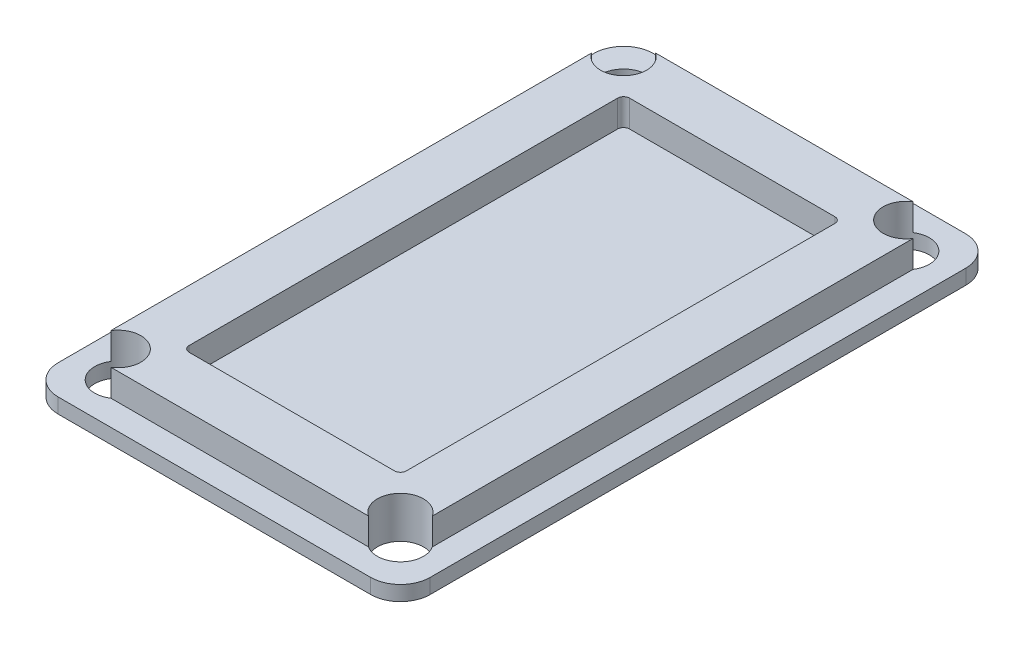
ISO-10303-21;
HEADER;
FILE_DESCRIPTION(('STEP AP214'),'2;1');
FILE_NAME('part.step','',(''),(''),'','','');
FILE_SCHEMA(('AUTOMOTIVE_DESIGN { 1 0 10303 214 1 1 1 1 }'));
ENDSEC;
DATA;
#1=APPLICATION_CONTEXT('core data for automotive mechanical design processes');
#2=APPLICATION_PROTOCOL_DEFINITION('international standard','automotive_design',2000,#1);
#3=PRODUCT_CONTEXT('',#1,'mechanical');
#4=PRODUCT('Part','Part','',(#3));
#5=PRODUCT_RELATED_PRODUCT_CATEGORY('part','',(#4));
#6=PRODUCT_DEFINITION_FORMATION('','',#4);
#7=PRODUCT_DEFINITION_CONTEXT('part definition',#1,'design');
#8=PRODUCT_DEFINITION('design','',#6,#7);
#9=PRODUCT_DEFINITION_SHAPE('','',#8);
#10=(LENGTH_UNIT() NAMED_UNIT(*) SI_UNIT(.MILLI.,.METRE.));
#11=(NAMED_UNIT(*) PLANE_ANGLE_UNIT() SI_UNIT($,.RADIAN.));
#12=(NAMED_UNIT(*) SI_UNIT($,.STERADIAN.) SOLID_ANGLE_UNIT());
#13=UNCERTAINTY_MEASURE_WITH_UNIT(LENGTH_MEASURE(1.E-05),#10,'distance_accuracy_value','');
#14=(GEOMETRIC_REPRESENTATION_CONTEXT(3) GLOBAL_UNCERTAINTY_ASSIGNED_CONTEXT((#13)) GLOBAL_UNIT_ASSIGNED_CONTEXT((#10,
#11,#12)) REPRESENTATION_CONTEXT('',''));
#15=CARTESIAN_POINT('',(0.,0.,0.));
#16=DIRECTION('',(0.,0.,1.));
#17=DIRECTION('',(1.,0.,0.));
#18=AXIS2_PLACEMENT_3D('',#15,#16,#17);
#19=CARTESIAN_POINT('',(10.5,2.8,-18.));
#20=DIRECTION('',(0.,1.,0.));
#21=DIRECTION('',(0.,0.,1.));
#22=AXIS2_PLACEMENT_3D('',#19,#20,#21);
#23=PLANE('',#22);
#24=CARTESIAN_POINT('',(-9.50000000000001,2.8,-17.));
#25=DIRECTION('',(0.,1.,0.));
#26=DIRECTION('',(0.,0.,1.));
#27=AXIS2_PLACEMENT_3D('',#24,#25,#26);
#28=CIRCLE('',#27,1.55);
#29=CARTESIAN_POINT('',(-8.65590284919331,2.8,-18.3));
#30=VERTEX_POINT('',#29);
#31=CARTESIAN_POINT('',(-10.8,2.8,-16.1559028491933));
#32=VERTEX_POINT('',#31);
#33=EDGE_CURVE('E626',#30,#32,#28,.F.);
#34=ORIENTED_EDGE('',*,*,#33,.T.);
#35=DIRECTION('',(0.,0.,1.));
#36=VECTOR('',#35,1.);
#37=CARTESIAN_POINT('',(-10.8,2.8,-18.));
#38=LINE('',#37,#36);
#39=CARTESIAN_POINT('',(-10.8,2.8,16.1559028491933));
#40=VERTEX_POINT('',#39);
#41=EDGE_CURVE('E237',#32,#40,#38,.T.);
#42=ORIENTED_EDGE('',*,*,#41,.T.);
#43=CARTESIAN_POINT('',(-9.50000000000001,2.8,17.));
#44=DIRECTION('',(0.,1.,0.));
#45=DIRECTION('',(0.,0.,1.));
#46=AXIS2_PLACEMENT_3D('',#43,#44,#45);
#47=CIRCLE('',#46,1.55);
#48=CARTESIAN_POINT('',(-8.6559028491933,2.8,18.3));
#49=VERTEX_POINT('',#48);
#50=EDGE_CURVE('E736',#40,#49,#47,.F.);
#51=ORIENTED_EDGE('',*,*,#50,.T.);
#52=DIRECTION('',(1.,0.,0.));
#53=VECTOR('',#52,1.);
#54=CARTESIAN_POINT('',(-10.5,2.8,18.3));
#55=LINE('',#54,#53);
#56=CARTESIAN_POINT('',(8.6559028491933,2.8,18.3));
#57=VERTEX_POINT('',#56);
#58=EDGE_CURVE('E646',#49,#57,#55,.T.);
#59=ORIENTED_EDGE('',*,*,#58,.T.);
#60=CARTESIAN_POINT('',(9.50000000000001,2.8,17.));
#61=DIRECTION('',(0.,1.,0.));
#62=DIRECTION('',(0.,0.,1.));
#63=AXIS2_PLACEMENT_3D('',#60,#61,#62);
#64=CIRCLE('',#63,1.55);
#65=CARTESIAN_POINT('',(10.8,2.8,16.1559028491933));
#66=VERTEX_POINT('',#65);
#67=EDGE_CURVE('E213',#57,#66,#64,.F.);
#68=ORIENTED_EDGE('',*,*,#67,.T.);
#69=DIRECTION('',(0.,0.,-1.));
#70=VECTOR('',#69,1.);
#71=CARTESIAN_POINT('',(10.8,2.8,18.));
#72=LINE('',#71,#70);
#73=CARTESIAN_POINT('',(10.8,2.8,-16.1559028491933));
#74=VERTEX_POINT('',#73);
#75=EDGE_CURVE('E221',#66,#74,#72,.T.);
#76=ORIENTED_EDGE('',*,*,#75,.T.);
#77=CARTESIAN_POINT('',(9.50000000000001,2.8,-17.));
#78=DIRECTION('',(0.,1.,0.));
#79=DIRECTION('',(0.,0.,1.));
#80=AXIS2_PLACEMENT_3D('',#77,#78,#79);
#81=CIRCLE('',#80,1.55);
#82=CARTESIAN_POINT('',(8.65590284919331,2.8,-18.3));
#83=VERTEX_POINT('',#82);
#84=EDGE_CURVE('E55',#74,#83,#81,.F.);
#85=ORIENTED_EDGE('',*,*,#84,.T.);
#86=DIRECTION('',(-1.,0.,0.));
#87=VECTOR('',#86,1.);
#88=CARTESIAN_POINT('',(10.5,2.8,-18.3));
#89=LINE('',#88,#87);
#90=EDGE_CURVE('E231',#83,#30,#89,.T.);
#91=ORIENTED_EDGE('',*,*,#90,.T.);
#92=EDGE_LOOP('',(#34,#42,#51,#59,#68,#76,#85,#91));
#93=FACE_BOUND('',#92,.T.);
#94=DIRECTION('',(1.,0.,0.));
#95=VECTOR('',#94,1.);
#96=CARTESIAN_POINT('',(-6.9,2.8,14.8));
#97=LINE('',#96,#95);
#98=CARTESIAN_POINT('',(-6.9,2.8,14.8));
#99=VERTEX_POINT('',#98);
#100=CARTESIAN_POINT('',(6.9,2.8,14.8));
#101=VERTEX_POINT('',#100);
#102=EDGE_CURVE('E725',#99,#101,#97,.T.);
#103=ORIENTED_EDGE('',*,*,#102,.F.);
#104=CARTESIAN_POINT('',(-6.9,2.8,14.4));
#105=DIRECTION('',(0.,1.,0.));
#106=DIRECTION('',(0.,0.,1.));
#107=AXIS2_PLACEMENT_3D('',#104,#105,#106);
#108=CIRCLE('',#107,0.4);
#109=CARTESIAN_POINT('',(-7.30000000000001,2.8,14.4));
#110=VERTEX_POINT('',#109);
#111=EDGE_CURVE('E677',#110,#99,#108,.T.);
#112=ORIENTED_EDGE('',*,*,#111,.F.);
#113=DIRECTION('',(0.,0.,1.));
#114=VECTOR('',#113,1.);
#115=CARTESIAN_POINT('',(-7.30000000000001,2.8,-14.4));
#116=LINE('',#115,#114);
#117=CARTESIAN_POINT('',(-7.30000000000001,2.8,-14.4));
#118=VERTEX_POINT('',#117);
#119=EDGE_CURVE('E672',#118,#110,#116,.T.);
#120=ORIENTED_EDGE('',*,*,#119,.F.);
#121=CARTESIAN_POINT('',(-6.9,2.8,-14.4));
#122=DIRECTION('',(0.,1.,0.));
#123=DIRECTION('',(0.,0.,1.));
#124=AXIS2_PLACEMENT_3D('',#121,#122,#123);
#125=CIRCLE('',#124,0.400000000000001);
#126=CARTESIAN_POINT('',(-6.9,2.8,-14.8));
#127=VERTEX_POINT('',#126);
#128=EDGE_CURVE('E709',#127,#118,#125,.T.);
#129=ORIENTED_EDGE('',*,*,#128,.F.);
#130=DIRECTION('',(-1.,0.,0.));
#131=VECTOR('',#130,1.);
#132=CARTESIAN_POINT('',(-6.9,2.8,-14.8));
#133=LINE('',#132,#131);
#134=CARTESIAN_POINT('',(6.9,2.8,-14.8));
#135=VERTEX_POINT('',#134);
#136=EDGE_CURVE('E713',#135,#127,#133,.T.);
#137=ORIENTED_EDGE('',*,*,#136,.F.);
#138=CARTESIAN_POINT('',(6.9,2.8,-14.4));
#139=DIRECTION('',(0.,1.,0.));
#140=DIRECTION('',(0.,0.,-1.));
#141=AXIS2_PLACEMENT_3D('',#138,#139,#140);
#142=CIRCLE('',#141,0.400000000000001);
#143=CARTESIAN_POINT('',(7.3,2.8,-14.4));
#144=VERTEX_POINT('',#143);
#145=EDGE_CURVE('E716',#144,#135,#142,.T.);
#146=ORIENTED_EDGE('',*,*,#145,.F.);
#147=DIRECTION('',(0.,0.,-1.));
#148=VECTOR('',#147,1.);
#149=CARTESIAN_POINT('',(7.3,2.8,-14.4));
#150=LINE('',#149,#148);
#151=CARTESIAN_POINT('',(7.3,2.8,14.4));
#152=VERTEX_POINT('',#151);
#153=EDGE_CURVE('E719',#152,#144,#150,.T.);
#154=ORIENTED_EDGE('',*,*,#153,.F.);
#155=CARTESIAN_POINT('',(6.9,2.8,14.4));
#156=DIRECTION('',(0.,1.,0.));
#157=DIRECTION('',(0.,0.,1.));
#158=AXIS2_PLACEMENT_3D('',#155,#156,#157);
#159=CIRCLE('',#158,0.399999999999999);
#160=EDGE_CURVE('E722',#101,#152,#159,.T.);
#161=ORIENTED_EDGE('',*,*,#160,.F.);
#162=EDGE_LOOP('',(#103,#112,#120,#129,#137,#146,#154,#161));
#163=FACE_BOUND('',#162,.T.);
#164=ADVANCED_FACE('F39',(#93,#163),#23,.T.);
#165=CARTESIAN_POINT('',(10.5,2.8,-18.3));
#166=DIRECTION('',(0.,0.,1.));
#167=DIRECTION('',(1.,0.,0.));
#168=AXIS2_PLACEMENT_3D('',#165,#166,#167);
#169=PLANE('',#168);
#170=DIRECTION('',(-1.,0.,0.));
#171=VECTOR('',#170,1.);
#172=CARTESIAN_POINT('',(10.5,1.,-18.3));
#173=LINE('',#172,#171);
#174=CARTESIAN_POINT('',(8.65590284919331,1.,-18.3));
#175=VERTEX_POINT('',#174);
#176=CARTESIAN_POINT('',(-8.65590284919331,1.,-18.3));
#177=VERTEX_POINT('',#176);
#178=EDGE_CURVE('E632',#175,#177,#173,.T.);
#179=ORIENTED_EDGE('',*,*,#178,.T.);
#180=DIRECTION('',(0.,-1.,0.));
#181=VECTOR('',#180,1.);
#182=CARTESIAN_POINT('',(-8.65590284919331,2.801,-18.3));
#183=LINE('',#182,#181);
#184=EDGE_CURVE('E622',#30,#177,#183,.T.);
#185=ORIENTED_EDGE('',*,*,#184,.F.);
#186=ORIENTED_EDGE('',*,*,#90,.F.);
#187=DIRECTION('',(0.,-1.,0.));
#188=VECTOR('',#187,1.);
#189=CARTESIAN_POINT('',(8.65590284919331,2.801,-18.3));
#190=LINE('',#189,#188);
#191=EDGE_CURVE('E633',#175,#83,#190,.F.);
#192=ORIENTED_EDGE('',*,*,#191,.F.);
#193=EDGE_LOOP('',(#179,#185,#186,#192));
#194=FACE_BOUND('',#193,.T.);
#195=ADVANCED_FACE('F367',(#194),#169,.F.);
#196=CARTESIAN_POINT('',(-10.8,2.8,-18.));
#197=DIRECTION('',(1.,0.,0.));
#198=DIRECTION('',(0.,0.,-1.));
#199=AXIS2_PLACEMENT_3D('',#196,#197,#198);
#200=PLANE('',#199);
#201=ORIENTED_EDGE('',*,*,#41,.F.);
#202=DIRECTION('',(0.,-1.,0.));
#203=VECTOR('',#202,1.);
#204=CARTESIAN_POINT('',(-10.8,2.801,-16.1559028491933));
#205=LINE('',#204,#203);
#206=CARTESIAN_POINT('',(-10.8,1.,-16.1559028491933));
#207=VERTEX_POINT('',#206);
#208=EDGE_CURVE('E746',#207,#32,#205,.F.);
#209=ORIENTED_EDGE('',*,*,#208,.F.);
#210=DIRECTION('',(0.,0.,1.));
#211=VECTOR('',#210,1.);
#212=CARTESIAN_POINT('',(-10.8,1.,-18.));
#213=LINE('',#212,#211);
#214=CARTESIAN_POINT('',(-10.8,1.,16.1559028491933));
#215=VERTEX_POINT('',#214);
#216=EDGE_CURVE('E239',#207,#215,#213,.T.);
#217=ORIENTED_EDGE('',*,*,#216,.T.);
#218=DIRECTION('',(0.,-1.,0.));
#219=VECTOR('',#218,1.);
#220=CARTESIAN_POINT('',(-10.8,2.801,16.1559028491933));
#221=LINE('',#220,#219);
#222=EDGE_CURVE('E706',#40,#215,#221,.T.);
#223=ORIENTED_EDGE('',*,*,#222,.F.);
#224=EDGE_LOOP('',(#201,#209,#217,#223));
#225=FACE_BOUND('',#224,.T.);
#226=ADVANCED_FACE('F373',(#225),#200,.F.);
#227=CARTESIAN_POINT('',(-10.5,2.8,18.3));
#228=DIRECTION('',(0.,0.,-1.));
#229=DIRECTION('',(-1.,0.,0.));
#230=AXIS2_PLACEMENT_3D('',#227,#228,#229);
#231=PLANE('',#230);
#232=DIRECTION('',(1.,0.,0.));
#233=VECTOR('',#232,1.);
#234=CARTESIAN_POINT('',(-10.5,1.,18.3));
#235=LINE('',#234,#233);
#236=CARTESIAN_POINT('',(-8.6559028491933,1.,18.3));
#237=VERTEX_POINT('',#236);
#238=CARTESIAN_POINT('',(8.6559028491933,1.,18.3));
#239=VERTEX_POINT('',#238);
#240=EDGE_CURVE('E232',#237,#239,#235,.T.);
#241=ORIENTED_EDGE('',*,*,#240,.T.);
#242=DIRECTION('',(0.,-1.,0.));
#243=VECTOR('',#242,1.);
#244=CARTESIAN_POINT('',(8.6559028491933,2.801,18.3));
#245=LINE('',#244,#243);
#246=EDGE_CURVE('E207',#57,#239,#245,.T.);
#247=ORIENTED_EDGE('',*,*,#246,.F.);
#248=ORIENTED_EDGE('',*,*,#58,.F.);
#249=DIRECTION('',(0.,-1.,0.));
#250=VECTOR('',#249,1.);
#251=CARTESIAN_POINT('',(-8.6559028491933,2.801,18.3));
#252=LINE('',#251,#250);
#253=EDGE_CURVE('E733',#237,#49,#252,.F.);
#254=ORIENTED_EDGE('',*,*,#253,.F.);
#255=EDGE_LOOP('',(#241,#247,#248,#254));
#256=FACE_BOUND('',#255,.T.);
#257=ADVANCED_FACE('F384',(#256),#231,.F.);
#258=CARTESIAN_POINT('',(10.8,2.8,18.));
#259=DIRECTION('',(-1.,0.,0.));
#260=DIRECTION('',(0.,0.,1.));
#261=AXIS2_PLACEMENT_3D('',#258,#259,#260);
#262=PLANE('',#261);
#263=DIRECTION('',(0.,0.,-1.));
#264=VECTOR('',#263,1.);
#265=CARTESIAN_POINT('',(10.8,1.,18.));
#266=LINE('',#265,#264);
#267=CARTESIAN_POINT('',(10.8,1.,16.1559028491933));
#268=VERTEX_POINT('',#267);
#269=CARTESIAN_POINT('',(10.8,1.,-16.1559028491933));
#270=VERTEX_POINT('',#269);
#271=EDGE_CURVE('E219',#268,#270,#266,.T.);
#272=ORIENTED_EDGE('',*,*,#271,.T.);
#273=DIRECTION('',(0.,-1.,0.));
#274=VECTOR('',#273,1.);
#275=CARTESIAN_POINT('',(10.8,2.801,-16.1559028491933));
#276=LINE('',#275,#274);
#277=EDGE_CURVE('E761',#74,#270,#276,.T.);
#278=ORIENTED_EDGE('',*,*,#277,.F.);
#279=ORIENTED_EDGE('',*,*,#75,.F.);
#280=DIRECTION('',(0.,-1.,0.));
#281=VECTOR('',#280,1.);
#282=CARTESIAN_POINT('',(10.8,2.801,16.1559028491933));
#283=LINE('',#282,#281);
#284=EDGE_CURVE('E204',#268,#66,#283,.F.);
#285=ORIENTED_EDGE('',*,*,#284,.F.);
#286=EDGE_LOOP('',(#272,#278,#279,#285));
#287=FACE_BOUND('',#286,.T.);
#288=ADVANCED_FACE('F218',(#287),#262,.F.);
#289=CARTESIAN_POINT('',(10.5,1.,-18.));
#290=DIRECTION('',(0.,-1.,0.));
#291=DIRECTION('',(0.,0.,-1.));
#292=AXIS2_PLACEMENT_3D('',#289,#290,#291);
#293=PLANE('',#292);
#294=CARTESIAN_POINT('',(10.5,1.,-18.));
#295=DIRECTION('',(0.,1.,0.));
#296=DIRECTION('',(0.,0.,-1.));
#297=AXIS2_PLACEMENT_3D('',#294,#295,#296);
#298=CIRCLE('',#297,2.);
#299=CARTESIAN_POINT('',(12.5,1.,-18.));
#300=VERTEX_POINT('',#299);
#301=CARTESIAN_POINT('',(10.5,1.,-20.));
#302=VERTEX_POINT('',#301);
#303=EDGE_CURVE('E243',#300,#302,#298,.T.);
#304=ORIENTED_EDGE('',*,*,#303,.T.);
#305=DIRECTION('',(-1.,0.,0.));
#306=VECTOR('',#305,1.);
#307=CARTESIAN_POINT('',(-10.5,1.,-20.));
#308=LINE('',#307,#306);
#309=CARTESIAN_POINT('',(-10.5,1.,-20.));
#310=VERTEX_POINT('',#309);
#311=EDGE_CURVE('E247',#302,#310,#308,.T.);
#312=ORIENTED_EDGE('',*,*,#311,.T.);
#313=CARTESIAN_POINT('',(-10.5,1.,-18.));
#314=DIRECTION('',(0.,1.,0.));
#315=DIRECTION('',(0.,0.,1.));
#316=AXIS2_PLACEMENT_3D('',#313,#314,#315);
#317=CIRCLE('',#316,2.);
#318=CARTESIAN_POINT('',(-12.5,1.,-18.));
#319=VERTEX_POINT('',#318);
#320=EDGE_CURVE('E251',#310,#319,#317,.T.);
#321=ORIENTED_EDGE('',*,*,#320,.T.);
#322=DIRECTION('',(0.,0.,1.));
#323=VECTOR('',#322,1.);
#324=CARTESIAN_POINT('',(-12.5,1.,-18.));
#325=LINE('',#324,#323);
#326=CARTESIAN_POINT('',(-12.5,1.,18.));
#327=VERTEX_POINT('',#326);
#328=EDGE_CURVE('E254',#319,#327,#325,.T.);
#329=ORIENTED_EDGE('',*,*,#328,.T.);
#330=CARTESIAN_POINT('',(-10.5,1.,18.));
#331=DIRECTION('',(0.,1.,0.));
#332=DIRECTION('',(0.,0.,1.));
#333=AXIS2_PLACEMENT_3D('',#330,#331,#332);
#334=CIRCLE('',#333,2.);
#335=CARTESIAN_POINT('',(-10.5,1.,20.));
#336=VERTEX_POINT('',#335);
#337=EDGE_CURVE('E257',#327,#336,#334,.T.);
#338=ORIENTED_EDGE('',*,*,#337,.T.);
#339=DIRECTION('',(1.,0.,0.));
#340=VECTOR('',#339,1.);
#341=CARTESIAN_POINT('',(-10.5,1.,20.));
#342=LINE('',#341,#340);
#343=CARTESIAN_POINT('',(10.5,1.,20.));
#344=VERTEX_POINT('',#343);
#345=EDGE_CURVE('E260',#336,#344,#342,.T.);
#346=ORIENTED_EDGE('',*,*,#345,.T.);
#347=CARTESIAN_POINT('',(10.5,1.,18.));
#348=DIRECTION('',(0.,1.,0.));
#349=DIRECTION('',(0.,0.,1.));
#350=AXIS2_PLACEMENT_3D('',#347,#348,#349);
#351=CIRCLE('',#350,2.);
#352=CARTESIAN_POINT('',(12.5,1.,18.));
#353=VERTEX_POINT('',#352);
#354=EDGE_CURVE('E263',#344,#353,#351,.T.);
#355=ORIENTED_EDGE('',*,*,#354,.T.);
#356=DIRECTION('',(0.,0.,-1.));
#357=VECTOR('',#356,1.);
#358=CARTESIAN_POINT('',(12.5,1.,-18.));
#359=LINE('',#358,#357);
#360=EDGE_CURVE('E266',#353,#300,#359,.T.);
#361=ORIENTED_EDGE('',*,*,#360,.T.);
#362=EDGE_LOOP('',(#304,#312,#321,#329,#338,#346,#355,#361));
#363=FACE_BOUND('',#362,.T.);
#364=ORIENTED_EDGE('',*,*,#216,.F.);
#365=CARTESIAN_POINT('',(-9.50000000000001,1.,-17.));
#366=DIRECTION('',(0.,-1.,0.));
#367=DIRECTION('',(0.,0.,-1.));
#368=AXIS2_PLACEMENT_3D('',#365,#366,#367);
#369=CIRCLE('',#368,1.55);
#370=EDGE_CURVE('E624',#177,#207,#369,.F.);
#371=ORIENTED_EDGE('',*,*,#370,.F.);
#372=ORIENTED_EDGE('',*,*,#178,.F.);
#373=CARTESIAN_POINT('',(9.50000000000001,1.,-17.));
#374=DIRECTION('',(0.,-1.,0.));
#375=DIRECTION('',(0.,0.,-1.));
#376=AXIS2_PLACEMENT_3D('',#373,#374,#375);
#377=CIRCLE('',#376,1.55);
#378=EDGE_CURVE('E229',#270,#175,#377,.F.);
#379=ORIENTED_EDGE('',*,*,#378,.F.);
#380=ORIENTED_EDGE('',*,*,#271,.F.);
#381=CARTESIAN_POINT('',(9.50000000000001,1.,17.));
#382=DIRECTION('',(0.,-1.,0.));
#383=DIRECTION('',(0.,0.,-1.));
#384=AXIS2_PLACEMENT_3D('',#381,#382,#383);
#385=CIRCLE('',#384,1.55);
#386=EDGE_CURVE('E201',#239,#268,#385,.F.);
#387=ORIENTED_EDGE('',*,*,#386,.F.);
#388=ORIENTED_EDGE('',*,*,#240,.F.);
#389=CARTESIAN_POINT('',(-9.50000000000001,1.,17.));
#390=DIRECTION('',(0.,-1.,0.));
#391=DIRECTION('',(0.,0.,-1.));
#392=AXIS2_PLACEMENT_3D('',#389,#390,#391);
#393=CIRCLE('',#392,1.55);
#394=EDGE_CURVE('E732',#215,#237,#393,.F.);
#395=ORIENTED_EDGE('',*,*,#394,.F.);
#396=EDGE_LOOP('',(#364,#371,#372,#379,#380,#387,#388,#395));
#397=FACE_BOUND('',#396,.T.);
#398=ADVANCED_FACE('F227',(#363,#397),#293,.F.);
#399=CARTESIAN_POINT('',(10.5,1.,-18.));
#400=DIRECTION('',(0.,-1.,0.));
#401=DIRECTION('',(0.,0.,-1.));
#402=AXIS2_PLACEMENT_3D('',#399,#400,#401);
#403=CYLINDRICAL_SURFACE('',#402,2.);
#404=CARTESIAN_POINT('',(10.5,0.,-18.));
#405=DIRECTION('',(0.,1.,0.));
#406=DIRECTION('',(0.,0.,-1.));
#407=AXIS2_PLACEMENT_3D('',#404,#405,#406);
#408=CIRCLE('',#407,2.);
#409=CARTESIAN_POINT('',(12.5,0.,-18.));
#410=VERTEX_POINT('',#409);
#411=CARTESIAN_POINT('',(10.5,0.,-20.));
#412=VERTEX_POINT('',#411);
#413=EDGE_CURVE('E270',#410,#412,#408,.T.);
#414=ORIENTED_EDGE('',*,*,#413,.T.);
#415=DIRECTION('',(0.,-1.,0.));
#416=VECTOR('',#415,1.);
#417=CARTESIAN_POINT('',(10.5,1.,-20.));
#418=LINE('',#417,#416);
#419=EDGE_CURVE('E11',#302,#412,#418,.T.);
#420=ORIENTED_EDGE('',*,*,#419,.F.);
#421=ORIENTED_EDGE('',*,*,#303,.F.);
#422=DIRECTION('',(0.,-1.,0.));
#423=VECTOR('',#422,1.);
#424=CARTESIAN_POINT('',(12.5,1.,-18.));
#425=LINE('',#424,#423);
#426=EDGE_CURVE('E269',#300,#410,#425,.T.);
#427=ORIENTED_EDGE('',*,*,#426,.T.);
#428=EDGE_LOOP('',(#414,#420,#421,#427));
#429=FACE_BOUND('',#428,.T.);
#430=ADVANCED_FACE('F41',(#429),#403,.T.);
#431=CARTESIAN_POINT('',(-10.5,1.,-20.));
#432=DIRECTION('',(0.,0.,1.));
#433=DIRECTION('',(1.,0.,0.));
#434=AXIS2_PLACEMENT_3D('',#431,#432,#433);
#435=PLANE('',#434);
#436=DIRECTION('',(-1.,0.,0.));
#437=VECTOR('',#436,1.);
#438=CARTESIAN_POINT('',(-10.5,0.,-20.));
#439=LINE('',#438,#437);
#440=CARTESIAN_POINT('',(-10.5,0.,-20.));
#441=VERTEX_POINT('',#440);
#442=EDGE_CURVE('E274',#412,#441,#439,.T.);
#443=ORIENTED_EDGE('',*,*,#442,.T.);
#444=DIRECTION('',(0.,-1.,0.));
#445=VECTOR('',#444,1.);
#446=CARTESIAN_POINT('',(-10.5,1.,-20.));
#447=LINE('',#446,#445);
#448=EDGE_CURVE('E48',#310,#441,#447,.T.);
#449=ORIENTED_EDGE('',*,*,#448,.F.);
#450=ORIENTED_EDGE('',*,*,#311,.F.);
#451=ORIENTED_EDGE('',*,*,#419,.T.);
#452=EDGE_LOOP('',(#443,#449,#450,#451));
#453=FACE_BOUND('',#452,.T.);
#454=ADVANCED_FACE('F344',(#453),#435,.F.);
#455=CARTESIAN_POINT('',(-10.5,1.,-18.));
#456=DIRECTION('',(0.,-1.,0.));
#457=DIRECTION('',(0.,0.,-1.));
#458=AXIS2_PLACEMENT_3D('',#455,#456,#457);
#459=CYLINDRICAL_SURFACE('',#458,2.);
#460=CARTESIAN_POINT('',(-10.5,0.,-18.));
#461=DIRECTION('',(0.,1.,0.));
#462=DIRECTION('',(0.,0.,1.));
#463=AXIS2_PLACEMENT_3D('',#460,#461,#462);
#464=CIRCLE('',#463,2.);
#465=CARTESIAN_POINT('',(-12.5,0.,-18.));
#466=VERTEX_POINT('',#465);
#467=EDGE_CURVE('E277',#441,#466,#464,.T.);
#468=ORIENTED_EDGE('',*,*,#467,.T.);
#469=DIRECTION('',(0.,-1.,0.));
#470=VECTOR('',#469,1.);
#471=CARTESIAN_POINT('',(-12.5,1.,-18.));
#472=LINE('',#471,#470);
#473=EDGE_CURVE('E313',#319,#466,#472,.T.);
#474=ORIENTED_EDGE('',*,*,#473,.F.);
#475=ORIENTED_EDGE('',*,*,#320,.F.);
#476=ORIENTED_EDGE('',*,*,#448,.T.);
#477=EDGE_LOOP('',(#468,#474,#475,#476));
#478=FACE_BOUND('',#477,.T.);
#479=ADVANCED_FACE('F322',(#478),#459,.T.);
#480=CARTESIAN_POINT('',(-12.5,1.,-18.));
#481=DIRECTION('',(1.,0.,0.));
#482=DIRECTION('',(0.,0.,-1.));
#483=AXIS2_PLACEMENT_3D('',#480,#481,#482);
#484=PLANE('',#483);
#485=DIRECTION('',(0.,0.,1.));
#486=VECTOR('',#485,1.);
#487=CARTESIAN_POINT('',(-12.5,0.,-18.));
#488=LINE('',#487,#486);
#489=CARTESIAN_POINT('',(-12.5,0.,18.));
#490=VERTEX_POINT('',#489);
#491=EDGE_CURVE('E280',#466,#490,#488,.T.);
#492=ORIENTED_EDGE('',*,*,#491,.T.);
#493=DIRECTION('',(0.,-1.,0.));
#494=VECTOR('',#493,1.);
#495=CARTESIAN_POINT('',(-12.5,1.,18.));
#496=LINE('',#495,#494);
#497=EDGE_CURVE('E309',#327,#490,#496,.T.);
#498=ORIENTED_EDGE('',*,*,#497,.F.);
#499=ORIENTED_EDGE('',*,*,#328,.F.);
#500=ORIENTED_EDGE('',*,*,#473,.T.);
#501=EDGE_LOOP('',(#492,#498,#499,#500));
#502=FACE_BOUND('',#501,.T.);
#503=ADVANCED_FACE('F333',(#502),#484,.F.);
#504=CARTESIAN_POINT('',(-10.5,1.,18.));
#505=DIRECTION('',(0.,-1.,0.));
#506=DIRECTION('',(0.,0.,-1.));
#507=AXIS2_PLACEMENT_3D('',#504,#505,#506);
#508=CYLINDRICAL_SURFACE('',#507,2.);
#509=CARTESIAN_POINT('',(-10.5,0.,18.));
#510=DIRECTION('',(0.,1.,0.));
#511=DIRECTION('',(0.,0.,1.));
#512=AXIS2_PLACEMENT_3D('',#509,#510,#511);
#513=CIRCLE('',#512,2.);
#514=CARTESIAN_POINT('',(-10.5,0.,20.));
#515=VERTEX_POINT('',#514);
#516=EDGE_CURVE('E283',#490,#515,#513,.T.);
#517=ORIENTED_EDGE('',*,*,#516,.T.);
#518=DIRECTION('',(0.,-1.,0.));
#519=VECTOR('',#518,1.);
#520=CARTESIAN_POINT('',(-10.5,1.,20.));
#521=LINE('',#520,#519);
#522=EDGE_CURVE('E305',#336,#515,#521,.T.);
#523=ORIENTED_EDGE('',*,*,#522,.F.);
#524=ORIENTED_EDGE('',*,*,#337,.F.);
#525=ORIENTED_EDGE('',*,*,#497,.T.);
#526=EDGE_LOOP('',(#517,#523,#524,#525));
#527=FACE_BOUND('',#526,.T.);
#528=ADVANCED_FACE('F337',(#527),#508,.T.);
#529=CARTESIAN_POINT('',(-10.5,1.,20.));
#530=DIRECTION('',(0.,0.,-1.));
#531=DIRECTION('',(-1.,0.,0.));
#532=AXIS2_PLACEMENT_3D('',#529,#530,#531);
#533=PLANE('',#532);
#534=DIRECTION('',(1.,0.,0.));
#535=VECTOR('',#534,1.);
#536=CARTESIAN_POINT('',(-10.5,0.,20.));
#537=LINE('',#536,#535);
#538=CARTESIAN_POINT('',(10.5,0.,20.));
#539=VERTEX_POINT('',#538);
#540=EDGE_CURVE('E286',#515,#539,#537,.T.);
#541=ORIENTED_EDGE('',*,*,#540,.T.);
#542=DIRECTION('',(0.,-1.,0.));
#543=VECTOR('',#542,1.);
#544=CARTESIAN_POINT('',(10.5,1.,20.));
#545=LINE('',#544,#543);
#546=EDGE_CURVE('E301',#344,#539,#545,.T.);
#547=ORIENTED_EDGE('',*,*,#546,.F.);
#548=ORIENTED_EDGE('',*,*,#345,.F.);
#549=ORIENTED_EDGE('',*,*,#522,.T.);
#550=EDGE_LOOP('',(#541,#547,#548,#549));
#551=FACE_BOUND('',#550,.T.);
#552=ADVANCED_FACE('F357',(#551),#533,.F.);
#553=CARTESIAN_POINT('',(10.5,1.,18.));
#554=DIRECTION('',(0.,-1.,0.));
#555=DIRECTION('',(0.,0.,-1.));
#556=AXIS2_PLACEMENT_3D('',#553,#554,#555);
#557=CYLINDRICAL_SURFACE('',#556,2.);
#558=CARTESIAN_POINT('',(10.5,0.,18.));
#559=DIRECTION('',(0.,1.,0.));
#560=DIRECTION('',(0.,0.,1.));
#561=AXIS2_PLACEMENT_3D('',#558,#559,#560);
#562=CIRCLE('',#561,2.);
#563=CARTESIAN_POINT('',(12.5,0.,18.));
#564=VERTEX_POINT('',#563);
#565=EDGE_CURVE('E289',#539,#564,#562,.T.);
#566=ORIENTED_EDGE('',*,*,#565,.T.);
#567=DIRECTION('',(0.,-1.,0.));
#568=VECTOR('',#567,1.);
#569=CARTESIAN_POINT('',(12.5,1.,18.));
#570=LINE('',#569,#568);
#571=EDGE_CURVE('E297',#353,#564,#570,.T.);
#572=ORIENTED_EDGE('',*,*,#571,.F.);
#573=ORIENTED_EDGE('',*,*,#354,.F.);
#574=ORIENTED_EDGE('',*,*,#546,.T.);
#575=EDGE_LOOP('',(#566,#572,#573,#574));
#576=FACE_BOUND('',#575,.T.);
#577=ADVANCED_FACE('F355',(#576),#557,.T.);
#578=CARTESIAN_POINT('',(12.5,1.,-18.));
#579=DIRECTION('',(-1.,0.,0.));
#580=DIRECTION('',(0.,0.,1.));
#581=AXIS2_PLACEMENT_3D('',#578,#579,#580);
#582=PLANE('',#581);
#583=DIRECTION('',(0.,0.,-1.));
#584=VECTOR('',#583,1.);
#585=CARTESIAN_POINT('',(12.5,0.,-18.));
#586=LINE('',#585,#584);
#587=EDGE_CURVE('E248',#564,#410,#586,.T.);
#588=ORIENTED_EDGE('',*,*,#587,.T.);
#589=ORIENTED_EDGE('',*,*,#426,.F.);
#590=ORIENTED_EDGE('',*,*,#360,.F.);
#591=ORIENTED_EDGE('',*,*,#571,.T.);
#592=EDGE_LOOP('',(#588,#589,#590,#591));
#593=FACE_BOUND('',#592,.T.);
#594=ADVANCED_FACE('F350',(#593),#582,.F.);
#595=CARTESIAN_POINT('',(10.5,0.,-18.));
#596=DIRECTION('',(0.,-1.,0.));
#597=DIRECTION('',(0.,0.,-1.));
#598=AXIS2_PLACEMENT_3D('',#595,#596,#597);
#599=PLANE('',#598);
#600=CARTESIAN_POINT('',(-9.50000000000001,0.,-17.));
#601=DIRECTION('',(0.,-1.,0.));
#602=DIRECTION('',(0.,0.,1.));
#603=AXIS2_PLACEMENT_3D('',#600,#601,#602);
#604=CIRCLE('',#603,1.55);
#605=CARTESIAN_POINT('',(-9.50000000000001,0.,-15.45));
#606=VERTEX_POINT('',#605);
#607=EDGE_CURVE('E619',#606,#606,#604,.T.);
#608=ORIENTED_EDGE('',*,*,#607,.F.);
#609=EDGE_LOOP('',(#608));
#610=FACE_BOUND('',#609,.T.);
#611=CARTESIAN_POINT('',(9.50000000000001,0.,-17.));
#612=DIRECTION('',(0.,-1.,0.));
#613=DIRECTION('',(0.,0.,-1.));
#614=AXIS2_PLACEMENT_3D('',#611,#612,#613);
#615=CIRCLE('',#614,1.55);
#616=CARTESIAN_POINT('',(9.50000000000001,0.,-18.55));
#617=VERTEX_POINT('',#616);
#618=EDGE_CURVE('E629',#617,#617,#615,.T.);
#619=ORIENTED_EDGE('',*,*,#618,.F.);
#620=EDGE_LOOP('',(#619));
#621=FACE_BOUND('',#620,.T.);
#622=CARTESIAN_POINT('',(9.50000000000001,0.,17.));
#623=DIRECTION('',(0.,-1.,0.));
#624=DIRECTION('',(0.,0.,1.));
#625=AXIS2_PLACEMENT_3D('',#622,#623,#624);
#626=CIRCLE('',#625,1.55);
#627=CARTESIAN_POINT('',(9.50000000000001,0.,18.55));
#628=VERTEX_POINT('',#627);
#629=EDGE_CURVE('E223',#628,#628,#626,.T.);
#630=ORIENTED_EDGE('',*,*,#629,.F.);
#631=EDGE_LOOP('',(#630));
#632=FACE_BOUND('',#631,.T.);
#633=CARTESIAN_POINT('',(-9.50000000000001,0.,17.));
#634=DIRECTION('',(0.,-1.,0.));
#635=DIRECTION('',(0.,0.,-1.));
#636=AXIS2_PLACEMENT_3D('',#633,#634,#635);
#637=CIRCLE('',#636,1.55);
#638=CARTESIAN_POINT('',(-9.50000000000001,0.,15.45));
#639=VERTEX_POINT('',#638);
#640=EDGE_CURVE('E737',#639,#639,#637,.T.);
#641=ORIENTED_EDGE('',*,*,#640,.F.);
#642=EDGE_LOOP('',(#641));
#643=FACE_BOUND('',#642,.T.);
#644=ORIENTED_EDGE('',*,*,#413,.F.);
#645=ORIENTED_EDGE('',*,*,#587,.F.);
#646=ORIENTED_EDGE('',*,*,#565,.F.);
#647=ORIENTED_EDGE('',*,*,#540,.F.);
#648=ORIENTED_EDGE('',*,*,#516,.F.);
#649=ORIENTED_EDGE('',*,*,#491,.F.);
#650=ORIENTED_EDGE('',*,*,#467,.F.);
#651=ORIENTED_EDGE('',*,*,#442,.F.);
#652=EDGE_LOOP('',(#644,#645,#646,#647,#648,#649,#650,#651));
#653=FACE_BOUND('',#652,.T.);
#654=ADVANCED_FACE('F328',(#610,#621,#632,#643,#653),#599,.T.);
#655=CARTESIAN_POINT('',(-6.9,2.8,14.4));
#656=DIRECTION('',(0.,-1.,0.));
#657=DIRECTION('',(0.,0.,-1.));
#658=AXIS2_PLACEMENT_3D('',#655,#656,#657);
#659=CYLINDRICAL_SURFACE('',#658,0.4);
#660=CARTESIAN_POINT('',(-6.9,1.,14.4));
#661=DIRECTION('',(0.,1.,0.));
#662=DIRECTION('',(0.,0.,1.));
#663=AXIS2_PLACEMENT_3D('',#660,#661,#662);
#664=CIRCLE('',#663,0.4);
#665=CARTESIAN_POINT('',(-7.30000000000001,1.,14.4));
#666=VERTEX_POINT('',#665);
#667=CARTESIAN_POINT('',(-6.9,1.,14.8));
#668=VERTEX_POINT('',#667);
#669=EDGE_CURVE('E702',#666,#668,#664,.T.);
#670=ORIENTED_EDGE('',*,*,#669,.F.);
#671=DIRECTION('',(0.,-1.,0.));
#672=VECTOR('',#671,1.);
#673=CARTESIAN_POINT('',(-7.30000000000001,2.8,14.4));
#674=LINE('',#673,#672);
#675=EDGE_CURVE('E63',#110,#666,#674,.T.);
#676=ORIENTED_EDGE('',*,*,#675,.F.);
#677=ORIENTED_EDGE('',*,*,#111,.T.);
#678=DIRECTION('',(0.,-1.,0.));
#679=VECTOR('',#678,1.);
#680=CARTESIAN_POINT('',(-6.9,2.8,14.8));
#681=LINE('',#680,#679);
#682=EDGE_CURVE('E635',#99,#668,#681,.T.);
#683=ORIENTED_EDGE('',*,*,#682,.T.);
#684=EDGE_LOOP('',(#670,#676,#677,#683));
#685=FACE_BOUND('',#684,.T.);
#686=ADVANCED_FACE('F380',(#685),#659,.F.);
#687=CARTESIAN_POINT('',(-6.9,2.8,14.8));
#688=DIRECTION('',(0.,0.,-1.));
#689=DIRECTION('',(-1.,0.,0.));
#690=AXIS2_PLACEMENT_3D('',#687,#688,#689);
#691=PLANE('',#690);
#692=DIRECTION('',(1.,0.,0.));
#693=VECTOR('',#692,1.);
#694=CARTESIAN_POINT('',(-6.9,1.,14.8));
#695=LINE('',#694,#693);
#696=CARTESIAN_POINT('',(6.9,1.,14.8));
#697=VERTEX_POINT('',#696);
#698=EDGE_CURVE('E698',#668,#697,#695,.T.);
#699=ORIENTED_EDGE('',*,*,#698,.F.);
#700=ORIENTED_EDGE('',*,*,#682,.F.);
#701=ORIENTED_EDGE('',*,*,#102,.T.);
#702=DIRECTION('',(0.,-1.,0.));
#703=VECTOR('',#702,1.);
#704=CARTESIAN_POINT('',(6.9,2.8,14.8));
#705=LINE('',#704,#703);
#706=EDGE_CURVE('E641',#101,#697,#705,.T.);
#707=ORIENTED_EDGE('',*,*,#706,.T.);
#708=EDGE_LOOP('',(#699,#700,#701,#707));
#709=FACE_BOUND('',#708,.T.);
#710=ADVANCED_FACE('F416',(#709),#691,.T.);
#711=CARTESIAN_POINT('',(6.9,2.8,14.4));
#712=DIRECTION('',(0.,-1.,0.));
#713=DIRECTION('',(0.,0.,-1.));
#714=AXIS2_PLACEMENT_3D('',#711,#712,#713);
#715=CYLINDRICAL_SURFACE('',#714,0.399999999999999);
#716=CARTESIAN_POINT('',(6.9,1.,14.4));
#717=DIRECTION('',(0.,1.,0.));
#718=DIRECTION('',(0.,0.,1.));
#719=AXIS2_PLACEMENT_3D('',#716,#717,#718);
#720=CIRCLE('',#719,0.399999999999999);
#721=CARTESIAN_POINT('',(7.3,1.,14.4));
#722=VERTEX_POINT('',#721);
#723=EDGE_CURVE('E694',#697,#722,#720,.T.);
#724=ORIENTED_EDGE('',*,*,#723,.F.);
#725=ORIENTED_EDGE('',*,*,#706,.F.);
#726=ORIENTED_EDGE('',*,*,#160,.T.);
#727=DIRECTION('',(0.,-1.,0.));
#728=VECTOR('',#727,1.);
#729=CARTESIAN_POINT('',(7.3,2.8,14.4));
#730=LINE('',#729,#728);
#731=EDGE_CURVE('E655',#152,#722,#730,.T.);
#732=ORIENTED_EDGE('',*,*,#731,.T.);
#733=EDGE_LOOP('',(#724,#725,#726,#732));
#734=FACE_BOUND('',#733,.T.);
#735=ADVANCED_FACE('F423',(#734),#715,.F.);
#736=CARTESIAN_POINT('',(7.3,2.8,-14.4));
#737=DIRECTION('',(-1.,0.,0.));
#738=DIRECTION('',(0.,0.,1.));
#739=AXIS2_PLACEMENT_3D('',#736,#737,#738);
#740=PLANE('',#739);
#741=DIRECTION('',(0.,0.,-1.));
#742=VECTOR('',#741,1.);
#743=CARTESIAN_POINT('',(7.3,1.,-14.4));
#744=LINE('',#743,#742);
#745=CARTESIAN_POINT('',(7.3,1.,-14.4));
#746=VERTEX_POINT('',#745);
#747=EDGE_CURVE('E690',#722,#746,#744,.T.);
#748=ORIENTED_EDGE('',*,*,#747,.F.);
#749=ORIENTED_EDGE('',*,*,#731,.F.);
#750=ORIENTED_EDGE('',*,*,#153,.T.);
#751=DIRECTION('',(0.,-1.,0.));
#752=VECTOR('',#751,1.);
#753=CARTESIAN_POINT('',(7.3,2.8,-14.4));
#754=LINE('',#753,#752);
#755=EDGE_CURVE('E658',#144,#746,#754,.T.);
#756=ORIENTED_EDGE('',*,*,#755,.T.);
#757=EDGE_LOOP('',(#748,#749,#750,#756));
#758=FACE_BOUND('',#757,.T.);
#759=ADVANCED_FACE('F430',(#758),#740,.T.);
#760=CARTESIAN_POINT('',(6.9,2.8,-14.4));
#761=DIRECTION('',(0.,-1.,0.));
#762=DIRECTION('',(0.,0.,-1.));
#763=AXIS2_PLACEMENT_3D('',#760,#761,#762);
#764=CYLINDRICAL_SURFACE('',#763,0.400000000000001);
#765=CARTESIAN_POINT('',(6.9,1.,-14.4));
#766=DIRECTION('',(0.,1.,0.));
#767=DIRECTION('',(0.,0.,-1.));
#768=AXIS2_PLACEMENT_3D('',#765,#766,#767);
#769=CIRCLE('',#768,0.400000000000001);
#770=CARTESIAN_POINT('',(6.9,1.,-14.8));
#771=VERTEX_POINT('',#770);
#772=EDGE_CURVE('E686',#746,#771,#769,.T.);
#773=ORIENTED_EDGE('',*,*,#772,.F.);
#774=ORIENTED_EDGE('',*,*,#755,.F.);
#775=ORIENTED_EDGE('',*,*,#145,.T.);
#776=DIRECTION('',(0.,-1.,0.));
#777=VECTOR('',#776,1.);
#778=CARTESIAN_POINT('',(6.9,2.8,-14.8));
#779=LINE('',#778,#777);
#780=EDGE_CURVE('E661',#135,#771,#779,.T.);
#781=ORIENTED_EDGE('',*,*,#780,.T.);
#782=EDGE_LOOP('',(#773,#774,#775,#781));
#783=FACE_BOUND('',#782,.T.);
#784=ADVANCED_FACE('F438',(#783),#764,.F.);
#785=CARTESIAN_POINT('',(-6.9,2.8,-14.8));
#786=DIRECTION('',(0.,0.,1.));
#787=DIRECTION('',(1.,0.,0.));
#788=AXIS2_PLACEMENT_3D('',#785,#786,#787);
#789=PLANE('',#788);
#790=DIRECTION('',(-1.,0.,0.));
#791=VECTOR('',#790,1.);
#792=CARTESIAN_POINT('',(-6.9,1.,-14.8));
#793=LINE('',#792,#791);
#794=CARTESIAN_POINT('',(-6.9,1.,-14.8));
#795=VERTEX_POINT('',#794);
#796=EDGE_CURVE('E682',#771,#795,#793,.T.);
#797=ORIENTED_EDGE('',*,*,#796,.F.);
#798=ORIENTED_EDGE('',*,*,#780,.F.);
#799=ORIENTED_EDGE('',*,*,#136,.T.);
#800=DIRECTION('',(0.,-1.,0.));
#801=VECTOR('',#800,1.);
#802=CARTESIAN_POINT('',(-6.9,2.8,-14.8));
#803=LINE('',#802,#801);
#804=EDGE_CURVE('E664',#127,#795,#803,.T.);
#805=ORIENTED_EDGE('',*,*,#804,.T.);
#806=EDGE_LOOP('',(#797,#798,#799,#805));
#807=FACE_BOUND('',#806,.T.);
#808=ADVANCED_FACE('F446',(#807),#789,.T.);
#809=CARTESIAN_POINT('',(-6.9,2.8,-14.4));
#810=DIRECTION('',(0.,-1.,0.));
#811=DIRECTION('',(0.,0.,-1.));
#812=AXIS2_PLACEMENT_3D('',#809,#810,#811);
#813=CYLINDRICAL_SURFACE('',#812,0.400000000000001);
#814=CARTESIAN_POINT('',(-6.9,1.,-14.4));
#815=DIRECTION('',(0.,1.,0.));
#816=DIRECTION('',(0.,0.,1.));
#817=AXIS2_PLACEMENT_3D('',#814,#815,#816);
#818=CIRCLE('',#817,0.400000000000001);
#819=CARTESIAN_POINT('',(-7.30000000000001,1.,-14.4));
#820=VERTEX_POINT('',#819);
#821=EDGE_CURVE('E678',#795,#820,#818,.T.);
#822=ORIENTED_EDGE('',*,*,#821,.F.);
#823=ORIENTED_EDGE('',*,*,#804,.F.);
#824=ORIENTED_EDGE('',*,*,#128,.T.);
#825=DIRECTION('',(0.,-1.,0.));
#826=VECTOR('',#825,1.);
#827=CARTESIAN_POINT('',(-7.30000000000001,2.8,-14.4));
#828=LINE('',#827,#826);
#829=EDGE_CURVE('E667',#118,#820,#828,.T.);
#830=ORIENTED_EDGE('',*,*,#829,.T.);
#831=EDGE_LOOP('',(#822,#823,#824,#830));
#832=FACE_BOUND('',#831,.T.);
#833=ADVANCED_FACE('F454',(#832),#813,.F.);
#834=CARTESIAN_POINT('',(-7.30000000000001,2.8,-14.4));
#835=DIRECTION('',(1.,0.,0.));
#836=DIRECTION('',(0.,0.,-1.));
#837=AXIS2_PLACEMENT_3D('',#834,#835,#836);
#838=PLANE('',#837);
#839=DIRECTION('',(0.,0.,1.));
#840=VECTOR('',#839,1.);
#841=CARTESIAN_POINT('',(-7.30000000000001,1.,-14.4));
#842=LINE('',#841,#840);
#843=EDGE_CURVE('E673',#820,#666,#842,.T.);
#844=ORIENTED_EDGE('',*,*,#843,.F.);
#845=ORIENTED_EDGE('',*,*,#829,.F.);
#846=ORIENTED_EDGE('',*,*,#119,.T.);
#847=ORIENTED_EDGE('',*,*,#675,.T.);
#848=EDGE_LOOP('',(#844,#845,#846,#847));
#849=FACE_BOUND('',#848,.T.);
#850=ADVANCED_FACE('F394',(#849),#838,.T.);
#851=ORIENTED_EDGE('',*,*,#843,.T.);
#852=ORIENTED_EDGE('',*,*,#669,.T.);
#853=ORIENTED_EDGE('',*,*,#698,.T.);
#854=ORIENTED_EDGE('',*,*,#723,.T.);
#855=ORIENTED_EDGE('',*,*,#747,.T.);
#856=ORIENTED_EDGE('',*,*,#772,.T.);
#857=ORIENTED_EDGE('',*,*,#796,.T.);
#858=ORIENTED_EDGE('',*,*,#821,.T.);
#859=EDGE_LOOP('',(#851,#852,#853,#854,#855,#856,#857,#858));
#860=FACE_BOUND('',#859,.T.);
#861=ADVANCED_FACE('F391',(#860),#293,.F.);
#862=CARTESIAN_POINT('',(9.50000000000001,2.801,17.));
#863=DIRECTION('',(0.,-1.,0.));
#864=DIRECTION('',(0.,0.,-1.));
#865=AXIS2_PLACEMENT_3D('',#862,#863,#864);
#866=CYLINDRICAL_SURFACE('',#865,1.55);
#867=ORIENTED_EDGE('',*,*,#629,.T.);
#868=EDGE_LOOP('',(#867));
#869=FACE_BOUND('',#868,.T.);
#870=ORIENTED_EDGE('',*,*,#386,.T.);
#871=ORIENTED_EDGE('',*,*,#284,.T.);
#872=ORIENTED_EDGE('',*,*,#67,.F.);
#873=ORIENTED_EDGE('',*,*,#246,.T.);
#874=EDGE_LOOP('',(#870,#871,#872,#873));
#875=FACE_BOUND('',#874,.T.);
#876=ADVANCED_FACE('F203',(#869,#875),#866,.F.);
#877=CARTESIAN_POINT('',(9.50000000000001,2.801,-17.));
#878=DIRECTION('',(0.,-1.,0.));
#879=DIRECTION('',(0.,0.,-1.));
#880=AXIS2_PLACEMENT_3D('',#877,#878,#879);
#881=CYLINDRICAL_SURFACE('',#880,1.55);
#882=ORIENTED_EDGE('',*,*,#618,.T.);
#883=EDGE_LOOP('',(#882));
#884=FACE_BOUND('',#883,.T.);
#885=ORIENTED_EDGE('',*,*,#378,.T.);
#886=ORIENTED_EDGE('',*,*,#191,.T.);
#887=ORIENTED_EDGE('',*,*,#84,.F.);
#888=ORIENTED_EDGE('',*,*,#277,.T.);
#889=EDGE_LOOP('',(#885,#886,#887,#888));
#890=FACE_BOUND('',#889,.T.);
#891=ADVANCED_FACE('F479',(#884,#890),#881,.F.);
#892=CARTESIAN_POINT('',(-9.50000000000001,2.801,17.));
#893=DIRECTION('',(0.,-1.,0.));
#894=DIRECTION('',(0.,0.,-1.));
#895=AXIS2_PLACEMENT_3D('',#892,#893,#894);
#896=CYLINDRICAL_SURFACE('',#895,1.55);
#897=ORIENTED_EDGE('',*,*,#640,.T.);
#898=EDGE_LOOP('',(#897));
#899=FACE_BOUND('',#898,.T.);
#900=ORIENTED_EDGE('',*,*,#394,.T.);
#901=ORIENTED_EDGE('',*,*,#253,.T.);
#902=ORIENTED_EDGE('',*,*,#50,.F.);
#903=ORIENTED_EDGE('',*,*,#222,.T.);
#904=EDGE_LOOP('',(#900,#901,#902,#903));
#905=FACE_BOUND('',#904,.T.);
#906=ADVANCED_FACE('F487',(#899,#905),#896,.F.);
#907=CARTESIAN_POINT('',(-9.50000000000001,2.801,-17.));
#908=DIRECTION('',(0.,-1.,0.));
#909=DIRECTION('',(0.,0.,-1.));
#910=AXIS2_PLACEMENT_3D('',#907,#908,#909);
#911=CYLINDRICAL_SURFACE('',#910,1.55);
#912=ORIENTED_EDGE('',*,*,#607,.T.);
#913=EDGE_LOOP('',(#912));
#914=FACE_BOUND('',#913,.T.);
#915=ORIENTED_EDGE('',*,*,#184,.T.);
#916=ORIENTED_EDGE('',*,*,#370,.T.);
#917=ORIENTED_EDGE('',*,*,#208,.T.);
#918=ORIENTED_EDGE('',*,*,#33,.F.);
#919=EDGE_LOOP('',(#915,#916,#917,#918));
#920=FACE_BOUND('',#919,.T.);
#921=ADVANCED_FACE('F495',(#914,#920),#911,.F.);
#922=CLOSED_SHELL('',(#164,#195,#226,#257,#288,#398,#430,#454,#479,#503,#528,#552,#577,#594,
#654,#686,#710,#735,#759,#784,#808,#833,#850,#861,#876,#891,#906,#921));
#923=MANIFOLD_SOLID_BREP('B2',#922);
#924=ADVANCED_BREP_SHAPE_REPRESENTATION('',(#18,#923),#14);
#925=SHAPE_DEFINITION_REPRESENTATION(#9,#924);
ENDSEC;
END-ISO-10303-21;
